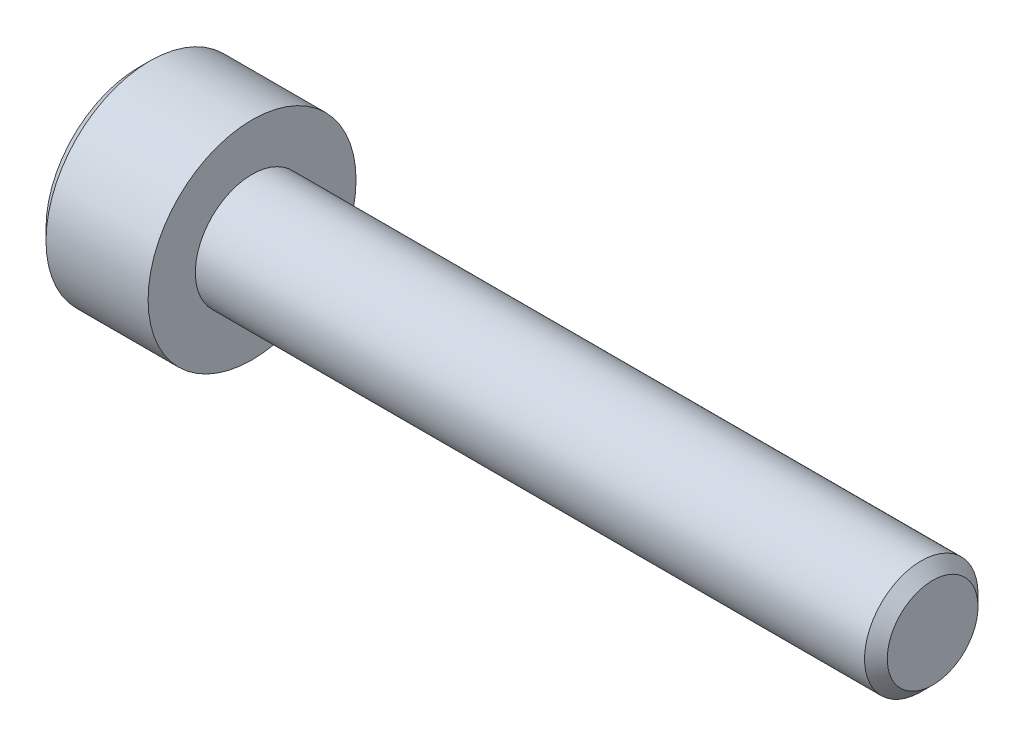
ISO-10303-21;
HEADER;
FILE_DESCRIPTION(('STEP AP214'),'2;1');
FILE_NAME('part.step','',(''),(''),'','','');
FILE_SCHEMA(('AUTOMOTIVE_DESIGN { 1 0 10303 214 1 1 1 1 }'));
ENDSEC;
DATA;
#1=APPLICATION_CONTEXT('core data for automotive mechanical design processes');
#2=APPLICATION_PROTOCOL_DEFINITION('international standard','automotive_design',2000,#1);
#3=PRODUCT_CONTEXT('',#1,'mechanical');
#4=PRODUCT('Part','Part','',(#3));
#5=PRODUCT_RELATED_PRODUCT_CATEGORY('part','',(#4));
#6=PRODUCT_DEFINITION_FORMATION('','',#4);
#7=PRODUCT_DEFINITION_CONTEXT('part definition',#1,'design');
#8=PRODUCT_DEFINITION('design','',#6,#7);
#9=PRODUCT_DEFINITION_SHAPE('','',#8);
#10=(LENGTH_UNIT() NAMED_UNIT(*) SI_UNIT(.MILLI.,.METRE.));
#11=(NAMED_UNIT(*) PLANE_ANGLE_UNIT() SI_UNIT($,.RADIAN.));
#12=(NAMED_UNIT(*) SI_UNIT($,.STERADIAN.) SOLID_ANGLE_UNIT());
#13=UNCERTAINTY_MEASURE_WITH_UNIT(LENGTH_MEASURE(1.E-05),#10,'distance_accuracy_value','');
#14=(GEOMETRIC_REPRESENTATION_CONTEXT(3) GLOBAL_UNCERTAINTY_ASSIGNED_CONTEXT((#13)) GLOBAL_UNIT_ASSIGNED_CONTEXT((#10,
#11,#12)) REPRESENTATION_CONTEXT('',''));
#15=CARTESIAN_POINT('',(0.,0.,0.));
#16=DIRECTION('',(0.,0.,1.));
#17=DIRECTION('',(1.,0.,0.));
#18=AXIS2_PLACEMENT_3D('',#15,#16,#17);
#19=CARTESIAN_POINT('',(-1.5,0.,0.));
#20=DIRECTION('',(-1.,0.,0.));
#21=DIRECTION('',(0.,0.,1.));
#22=AXIS2_PLACEMENT_3D('',#19,#20,#21);
#23=PLANE('',#22);
#24=DIRECTION('',(0.,-1.,0.));
#25=VECTOR('',#24,1.);
#26=CARTESIAN_POINT('',(-1.5,0.721687836487031,-1.25));
#27=LINE('',#26,#25);
#28=CARTESIAN_POINT('',(-1.5,0.721687836487031,-1.25));
#29=VERTEX_POINT('',#28);
#30=CARTESIAN_POINT('',(-1.50000000002341,0.,-1.25));
#31=VERTEX_POINT('',#30);
#32=EDGE_CURVE('E160',#29,#31,#27,.T.);
#33=ORIENTED_EDGE('',*,*,#32,.T.);
#34=CARTESIAN_POINT('',(-1.50000000002341,0.,0.));
#35=DIRECTION('',(1.,0.,0.));
#36=DIRECTION('',(0.,0.,-1.));
#37=AXIS2_PLACEMENT_3D('',#34,#35,#36);
#38=CIRCLE('',#37,1.24999999997044);
#39=CARTESIAN_POINT('',(-1.50000000002341,1.08253175470495,-0.624999999985219));
#40=VERTEX_POINT('',#39);
#41=EDGE_CURVE('E50',#31,#40,#38,.T.);
#42=ORIENTED_EDGE('',*,*,#41,.T.);
#43=DIRECTION('',(0.,-0.499999999999998,-0.86602540378444));
#44=VECTOR('',#43,1.);
#45=CARTESIAN_POINT('',(-1.5,1.44337567297406,0.));
#46=LINE('',#45,#44);
#47=EDGE_CURVE('E247',#40,#29,#46,.T.);
#48=ORIENTED_EDGE('',*,*,#47,.T.);
#49=EDGE_LOOP('',(#33,#42,#48));
#50=FACE_BOUND('',#49,.T.);
#51=ADVANCED_FACE('F35',(#50),#23,.T.);
#52=CARTESIAN_POINT('',(-1.5,1.44337567297406,0.));
#53=VERTEX_POINT('',#52);
#54=EDGE_CURVE('E248',#53,#40,#46,.T.);
#55=ORIENTED_EDGE('',*,*,#54,.T.);
#56=CARTESIAN_POINT('',(-1.50000000002341,1.08253175470495,0.624999999985218));
#57=VERTEX_POINT('',#56);
#58=EDGE_CURVE('E200',#40,#57,#38,.T.);
#59=ORIENTED_EDGE('',*,*,#58,.T.);
#60=DIRECTION('',(0.,0.499999999999998,-0.86602540378444));
#61=VECTOR('',#60,1.);
#62=CARTESIAN_POINT('',(-1.5,0.721687836487032,1.25));
#63=LINE('',#62,#61);
#64=EDGE_CURVE('E244',#57,#53,#63,.T.);
#65=ORIENTED_EDGE('',*,*,#64,.T.);
#66=EDGE_LOOP('',(#55,#59,#65));
#67=FACE_BOUND('',#66,.T.);
#68=ADVANCED_FACE('F123',(#67),#23,.T.);
#69=CARTESIAN_POINT('',(-1.5,0.721687836487032,1.25));
#70=VERTEX_POINT('',#69);
#71=EDGE_CURVE('E245',#70,#57,#63,.T.);
#72=ORIENTED_EDGE('',*,*,#71,.T.);
#73=CARTESIAN_POINT('',(-1.50000000002341,0.,1.24999999997044));
#74=VERTEX_POINT('',#73);
#75=EDGE_CURVE('E384',#57,#74,#38,.T.);
#76=ORIENTED_EDGE('',*,*,#75,.T.);
#77=DIRECTION('',(0.,1.,0.));
#78=VECTOR('',#77,1.);
#79=CARTESIAN_POINT('',(-1.5,-0.721687836487031,1.25));
#80=LINE('',#79,#78);
#81=EDGE_CURVE('E240',#74,#70,#80,.T.);
#82=ORIENTED_EDGE('',*,*,#81,.T.);
#83=EDGE_LOOP('',(#72,#76,#82));
#84=FACE_BOUND('',#83,.T.);
#85=ADVANCED_FACE('F129',(#84),#23,.T.);
#86=CARTESIAN_POINT('',(-1.5,-0.721687836487031,1.25));
#87=VERTEX_POINT('',#86);
#88=EDGE_CURVE('E228',#87,#74,#80,.T.);
#89=ORIENTED_EDGE('',*,*,#88,.T.);
#90=CARTESIAN_POINT('',(-1.50000000002341,-1.08253175470495,0.624999999985219));
#91=VERTEX_POINT('',#90);
#92=EDGE_CURVE('E382',#74,#91,#38,.T.);
#93=ORIENTED_EDGE('',*,*,#92,.T.);
#94=DIRECTION('',(0.,0.499999999999999,0.866025403784439));
#95=VECTOR('',#94,1.);
#96=CARTESIAN_POINT('',(-1.5,-1.44337567297406,0.));
#97=LINE('',#96,#95);
#98=EDGE_CURVE('E180',#91,#87,#97,.T.);
#99=ORIENTED_EDGE('',*,*,#98,.T.);
#100=EDGE_LOOP('',(#89,#93,#99));
#101=FACE_BOUND('',#100,.T.);
#102=ADVANCED_FACE('F144',(#101),#23,.T.);
#103=CARTESIAN_POINT('',(-1.5,-1.44337567297406,0.));
#104=VERTEX_POINT('',#103);
#105=EDGE_CURVE('E233',#104,#91,#97,.T.);
#106=ORIENTED_EDGE('',*,*,#105,.T.);
#107=CARTESIAN_POINT('',(-1.50000000002341,-1.08253175470495,-0.624999999985218));
#108=VERTEX_POINT('',#107);
#109=EDGE_CURVE('E238',#91,#108,#38,.T.);
#110=ORIENTED_EDGE('',*,*,#109,.T.);
#111=DIRECTION('',(0.,-0.499999999999998,0.86602540378444));
#112=VECTOR('',#111,1.);
#113=CARTESIAN_POINT('',(-1.5,-0.721687836487032,-1.25));
#114=LINE('',#113,#112);
#115=EDGE_CURVE('E156',#108,#104,#114,.T.);
#116=ORIENTED_EDGE('',*,*,#115,.T.);
#117=EDGE_LOOP('',(#106,#110,#116));
#118=FACE_BOUND('',#117,.T.);
#119=ADVANCED_FACE('F135',(#118),#23,.T.);
#120=CARTESIAN_POINT('',(-1.5,-0.721687836487032,-1.25));
#121=VERTEX_POINT('',#120);
#122=EDGE_CURVE('E148',#121,#108,#114,.T.);
#123=ORIENTED_EDGE('',*,*,#122,.T.);
#124=EDGE_CURVE('E149',#108,#31,#38,.T.);
#125=ORIENTED_EDGE('',*,*,#124,.T.);
#126=EDGE_CURVE('E151',#31,#121,#27,.T.);
#127=ORIENTED_EDGE('',*,*,#126,.T.);
#128=EDGE_LOOP('',(#123,#125,#127));
#129=FACE_BOUND('',#128,.T.);
#130=ADVANCED_FACE('F125',(#129),#23,.T.);
#131=CARTESIAN_POINT('',(0.,0.,0.));
#132=DIRECTION('',(1.,0.,0.));
#133=DIRECTION('',(0.,0.,-1.));
#134=AXIS2_PLACEMENT_3D('',#131,#132,#133);
#135=PLANE('',#134);
#136=CARTESIAN_POINT('',(0.,0.,0.));
#137=DIRECTION('',(1.,0.,0.));
#138=DIRECTION('',(0.,0.,-1.));
#139=AXIS2_PLACEMENT_3D('',#136,#137,#138);
#140=CIRCLE('',#139,2.75);
#141=CARTESIAN_POINT('',(0.,0.,-2.75));
#142=VERTEX_POINT('',#141);
#143=EDGE_CURVE('E193',#142,#142,#140,.T.);
#144=ORIENTED_EDGE('',*,*,#143,.T.);
#145=EDGE_LOOP('',(#144));
#146=FACE_BOUND('',#145,.T.);
#147=CARTESIAN_POINT('',(0.,0.,0.));
#148=DIRECTION('',(1.,0.,0.));
#149=DIRECTION('',(0.,0.,-1.));
#150=AXIS2_PLACEMENT_3D('',#147,#148,#149);
#151=CIRCLE('',#150,1.5);
#152=CARTESIAN_POINT('',(0.,0.,-1.5));
#153=VERTEX_POINT('',#152);
#154=EDGE_CURVE('E183',#153,#153,#151,.T.);
#155=ORIENTED_EDGE('',*,*,#154,.F.);
#156=EDGE_LOOP('',(#155));
#157=FACE_BOUND('',#156,.T.);
#158=ADVANCED_FACE('F134',(#146,#157),#135,.T.);
#159=CARTESIAN_POINT('',(-3.,0.,0.));
#160=DIRECTION('',(1.,0.,0.));
#161=DIRECTION('',(0.,0.,-1.));
#162=AXIS2_PLACEMENT_3D('',#159,#160,#161);
#163=CYLINDRICAL_SURFACE('',#162,2.75);
#164=CARTESIAN_POINT('',(-2.70000000001219,0.,0.));
#165=DIRECTION('',(-1.,0.,0.));
#166=DIRECTION('',(0.,0.,1.));
#167=AXIS2_PLACEMENT_3D('',#164,#165,#166);
#168=CIRCLE('',#167,2.75);
#169=CARTESIAN_POINT('',(-2.70000000001219,0.,2.75));
#170=VERTEX_POINT('',#169);
#171=EDGE_CURVE('E43',#170,#170,#168,.F.);
#172=ORIENTED_EDGE('',*,*,#171,.T.);
#173=EDGE_LOOP('',(#172));
#174=FACE_BOUND('',#173,.T.);
#175=ORIENTED_EDGE('',*,*,#143,.F.);
#176=EDGE_LOOP('',(#175));
#177=FACE_BOUND('',#176,.T.);
#178=ADVANCED_FACE('F141',(#174,#177),#163,.T.);
#179=CARTESIAN_POINT('',(-3.,2.75,0.));
#180=DIRECTION('',(-1.,0.,0.));
#181=DIRECTION('',(0.,0.,1.));
#182=AXIS2_PLACEMENT_3D('',#179,#180,#181);
#183=PLANE('',#182);
#184=CARTESIAN_POINT('',(-3.,0.,0.));
#185=DIRECTION('',(-1.,0.,0.));
#186=DIRECTION('',(0.,0.,1.));
#187=AXIS2_PLACEMENT_3D('',#184,#185,#186);
#188=CIRCLE('',#187,2.45000000001219);
#189=CARTESIAN_POINT('',(-3.,0.,2.45000000001219));
#190=VERTEX_POINT('',#189);
#191=EDGE_CURVE('E11',#190,#190,#188,.T.);
#192=ORIENTED_EDGE('',*,*,#191,.T.);
#193=EDGE_LOOP('',(#192));
#194=FACE_BOUND('',#193,.T.);
#195=DIRECTION('',(0.,0.499999999999999,0.866025403784439));
#196=VECTOR('',#195,1.);
#197=CARTESIAN_POINT('',(-3.,-1.44337567297406,0.));
#198=LINE('',#197,#196);
#199=CARTESIAN_POINT('',(-3.,-1.44337567297406,0.));
#200=VERTEX_POINT('',#199);
#201=CARTESIAN_POINT('',(-3.,-0.721687836487031,1.25));
#202=VERTEX_POINT('',#201);
#203=EDGE_CURVE('E58',#200,#202,#198,.T.);
#204=ORIENTED_EDGE('',*,*,#203,.F.);
#205=DIRECTION('',(0.,-0.499999999999998,0.86602540378444));
#206=VECTOR('',#205,1.);
#207=CARTESIAN_POINT('',(-3.,-0.721687836487032,-1.25));
#208=LINE('',#207,#206);
#209=CARTESIAN_POINT('',(-3.,-0.721687836487032,-1.25));
#210=VERTEX_POINT('',#209);
#211=EDGE_CURVE('E177',#210,#200,#208,.T.);
#212=ORIENTED_EDGE('',*,*,#211,.F.);
#213=DIRECTION('',(0.,-1.,0.));
#214=VECTOR('',#213,1.);
#215=CARTESIAN_POINT('',(-3.,0.721687836487031,-1.25));
#216=LINE('',#215,#214);
#217=CARTESIAN_POINT('',(-3.,0.721687836487031,-1.25));
#218=VERTEX_POINT('',#217);
#219=EDGE_CURVE('E174',#218,#210,#216,.T.);
#220=ORIENTED_EDGE('',*,*,#219,.F.);
#221=DIRECTION('',(0.,-0.499999999999998,-0.86602540378444));
#222=VECTOR('',#221,1.);
#223=CARTESIAN_POINT('',(-3.,1.44337567297406,0.));
#224=LINE('',#223,#222);
#225=CARTESIAN_POINT('',(-3.,1.44337567297406,0.));
#226=VERTEX_POINT('',#225);
#227=EDGE_CURVE('E171',#226,#218,#224,.T.);
#228=ORIENTED_EDGE('',*,*,#227,.F.);
#229=DIRECTION('',(0.,0.499999999999998,-0.86602540378444));
#230=VECTOR('',#229,1.);
#231=CARTESIAN_POINT('',(-3.,0.721687836487032,1.25));
#232=LINE('',#231,#230);
#233=CARTESIAN_POINT('',(-3.,0.721687836487032,1.25));
#234=VERTEX_POINT('',#233);
#235=EDGE_CURVE('E168',#234,#226,#232,.T.);
#236=ORIENTED_EDGE('',*,*,#235,.F.);
#237=DIRECTION('',(0.,1.,0.));
#238=VECTOR('',#237,1.);
#239=CARTESIAN_POINT('',(-3.,-0.721687836487031,1.25));
#240=LINE('',#239,#238);
#241=EDGE_CURVE('E165',#202,#234,#240,.T.);
#242=ORIENTED_EDGE('',*,*,#241,.F.);
#243=EDGE_LOOP('',(#204,#212,#220,#228,#236,#242));
#244=FACE_BOUND('',#243,.T.);
#245=ADVANCED_FACE('F213',(#194,#244),#183,.T.);
#246=CARTESIAN_POINT('',(18.,0.,0.));
#247=DIRECTION('',(-1.,0.,0.));
#248=DIRECTION('',(0.,0.,1.));
#249=AXIS2_PLACEMENT_3D('',#246,#247,#248);
#250=CYLINDRICAL_SURFACE('',#249,1.5);
#251=CARTESIAN_POINT('',(17.7000000000122,0.,0.));
#252=DIRECTION('',(1.,0.,0.));
#253=DIRECTION('',(0.,0.,-1.));
#254=AXIS2_PLACEMENT_3D('',#251,#252,#253);
#255=CIRCLE('',#254,1.5);
#256=CARTESIAN_POINT('',(17.7000000000122,0.,-1.5));
#257=VERTEX_POINT('',#256);
#258=EDGE_CURVE('E199',#257,#257,#255,.F.);
#259=ORIENTED_EDGE('',*,*,#258,.T.);
#260=EDGE_LOOP('',(#259));
#261=FACE_BOUND('',#260,.T.);
#262=ORIENTED_EDGE('',*,*,#154,.T.);
#263=EDGE_LOOP('',(#262));
#264=FACE_BOUND('',#263,.T.);
#265=ADVANCED_FACE('F216',(#261,#264),#250,.T.);
#266=CARTESIAN_POINT('',(18.,0.,0.));
#267=DIRECTION('',(1.,0.,0.));
#268=DIRECTION('',(0.,0.,-1.));
#269=AXIS2_PLACEMENT_3D('',#266,#267,#268);
#270=PLANE('',#269);
#271=CARTESIAN_POINT('',(18.,0.,0.));
#272=DIRECTION('',(1.,0.,0.));
#273=DIRECTION('',(0.,0.,-1.));
#274=AXIS2_PLACEMENT_3D('',#271,#272,#273);
#275=CIRCLE('',#274,1.20000000001219);
#276=CARTESIAN_POINT('',(18.,0.,-1.20000000001219));
#277=VERTEX_POINT('',#276);
#278=EDGE_CURVE('E196',#277,#277,#275,.T.);
#279=ORIENTED_EDGE('',*,*,#278,.T.);
#280=EDGE_LOOP('',(#279));
#281=FACE_BOUND('',#280,.T.);
#282=ADVANCED_FACE('F266',(#281),#270,.T.);
#283=CARTESIAN_POINT('',(-1.5,-1.44337567297406,0.));
#284=DIRECTION('',(0.,-0.866025403784439,0.499999999999999));
#285=DIRECTION('',(0.,-0.499999999999999,-0.866025403784439));
#286=AXIS2_PLACEMENT_3D('',#283,#284,#285);
#287=PLANE('',#286);
#288=ORIENTED_EDGE('',*,*,#203,.T.);
#289=DIRECTION('',(-1.,0.,0.));
#290=VECTOR('',#289,1.);
#291=CARTESIAN_POINT('',(-1.5,-0.721687836487031,1.25));
#292=LINE('',#291,#290);
#293=EDGE_CURVE('E155',#87,#202,#292,.T.);
#294=ORIENTED_EDGE('',*,*,#293,.F.);
#295=ORIENTED_EDGE('',*,*,#98,.F.);
#296=ORIENTED_EDGE('',*,*,#105,.F.);
#297=DIRECTION('',(-1.,0.,0.));
#298=VECTOR('',#297,1.);
#299=CARTESIAN_POINT('',(-1.5,-1.44337567297406,0.));
#300=LINE('',#299,#298);
#301=EDGE_CURVE('E181',#104,#200,#300,.T.);
#302=ORIENTED_EDGE('',*,*,#301,.T.);
#303=EDGE_LOOP('',(#288,#294,#295,#296,#302));
#304=FACE_BOUND('',#303,.T.);
#305=ADVANCED_FACE('F230',(#304),#287,.F.);
#306=CARTESIAN_POINT('',(-1.5,-0.721687836487032,-1.25));
#307=DIRECTION('',(0.,-0.86602540378444,-0.499999999999998));
#308=DIRECTION('',(0.,0.499999999999998,-0.86602540378444));
#309=AXIS2_PLACEMENT_3D('',#306,#307,#308);
#310=PLANE('',#309);
#311=ORIENTED_EDGE('',*,*,#211,.T.);
#312=ORIENTED_EDGE('',*,*,#301,.F.);
#313=ORIENTED_EDGE('',*,*,#115,.F.);
#314=ORIENTED_EDGE('',*,*,#122,.F.);
#315=DIRECTION('',(-1.,0.,0.));
#316=VECTOR('',#315,1.);
#317=CARTESIAN_POINT('',(-1.5,-0.721687836487032,-1.25));
#318=LINE('',#317,#316);
#319=EDGE_CURVE('E184',#121,#210,#318,.T.);
#320=ORIENTED_EDGE('',*,*,#319,.T.);
#321=EDGE_LOOP('',(#311,#312,#313,#314,#320));
#322=FACE_BOUND('',#321,.T.);
#323=ADVANCED_FACE('F259',(#322),#310,.F.);
#324=CARTESIAN_POINT('',(-1.5,0.721687836487031,-1.25));
#325=DIRECTION('',(0.,0.,-1.));
#326=DIRECTION('',(0.,1.,0.));
#327=AXIS2_PLACEMENT_3D('',#324,#325,#326);
#328=PLANE('',#327);
#329=ORIENTED_EDGE('',*,*,#219,.T.);
#330=ORIENTED_EDGE('',*,*,#319,.F.);
#331=ORIENTED_EDGE('',*,*,#126,.F.);
#332=ORIENTED_EDGE('',*,*,#32,.F.);
#333=DIRECTION('',(-1.,0.,0.));
#334=VECTOR('',#333,1.);
#335=CARTESIAN_POINT('',(-1.5,0.721687836487031,-1.25));
#336=LINE('',#335,#334);
#337=EDGE_CURVE('E186',#29,#218,#336,.T.);
#338=ORIENTED_EDGE('',*,*,#337,.T.);
#339=EDGE_LOOP('',(#329,#330,#331,#332,#338));
#340=FACE_BOUND('',#339,.T.);
#341=ADVANCED_FACE('F258',(#340),#328,.F.);
#342=CARTESIAN_POINT('',(-1.5,1.44337567297406,0.));
#343=DIRECTION('',(0.,0.86602540378444,-0.499999999999998));
#344=DIRECTION('',(0.,0.499999999999998,0.86602540378444));
#345=AXIS2_PLACEMENT_3D('',#342,#343,#344);
#346=PLANE('',#345);
#347=ORIENTED_EDGE('',*,*,#227,.T.);
#348=ORIENTED_EDGE('',*,*,#337,.F.);
#349=ORIENTED_EDGE('',*,*,#47,.F.);
#350=ORIENTED_EDGE('',*,*,#54,.F.);
#351=DIRECTION('',(-1.,0.,0.));
#352=VECTOR('',#351,1.);
#353=CARTESIAN_POINT('',(-1.5,1.44337567297406,0.));
#354=LINE('',#353,#352);
#355=EDGE_CURVE('E188',#53,#226,#354,.T.);
#356=ORIENTED_EDGE('',*,*,#355,.T.);
#357=EDGE_LOOP('',(#347,#348,#349,#350,#356));
#358=FACE_BOUND('',#357,.T.);
#359=ADVANCED_FACE('F256',(#358),#346,.F.);
#360=CARTESIAN_POINT('',(-1.5,0.721687836487032,1.25));
#361=DIRECTION('',(0.,0.86602540378444,0.499999999999998));
#362=DIRECTION('',(0.,-0.499999999999998,0.86602540378444));
#363=AXIS2_PLACEMENT_3D('',#360,#361,#362);
#364=PLANE('',#363);
#365=ORIENTED_EDGE('',*,*,#235,.T.);
#366=ORIENTED_EDGE('',*,*,#355,.F.);
#367=ORIENTED_EDGE('',*,*,#64,.F.);
#368=ORIENTED_EDGE('',*,*,#71,.F.);
#369=DIRECTION('',(-1.,0.,0.));
#370=VECTOR('',#369,1.);
#371=CARTESIAN_POINT('',(-1.5,0.721687836487032,1.25));
#372=LINE('',#371,#370);
#373=EDGE_CURVE('E158',#70,#234,#372,.T.);
#374=ORIENTED_EDGE('',*,*,#373,.T.);
#375=EDGE_LOOP('',(#365,#366,#367,#368,#374));
#376=FACE_BOUND('',#375,.T.);
#377=ADVANCED_FACE('F118',(#376),#364,.F.);
#378=CARTESIAN_POINT('',(-1.5,-0.721687836487031,1.25));
#379=DIRECTION('',(0.,0.,1.));
#380=DIRECTION('',(1.,0.,0.));
#381=AXIS2_PLACEMENT_3D('',#378,#379,#380);
#382=PLANE('',#381);
#383=ORIENTED_EDGE('',*,*,#241,.T.);
#384=ORIENTED_EDGE('',*,*,#373,.F.);
#385=ORIENTED_EDGE('',*,*,#81,.F.);
#386=ORIENTED_EDGE('',*,*,#88,.F.);
#387=ORIENTED_EDGE('',*,*,#293,.T.);
#388=EDGE_LOOP('',(#383,#384,#385,#386,#387));
#389=FACE_BOUND('',#388,.T.);
#390=ADVANCED_FACE('F111',(#389),#382,.F.);
#391=CARTESIAN_POINT('',(-1.16506350937176,0.,0.));
#392=DIRECTION('',(-1.,0.,0.));
#393=DIRECTION('',(0.,0.,1.));
#394=AXIS2_PLACEMENT_3D('',#391,#392,#393);
#395=CONICAL_SURFACE('',#394,0.,1.30899693890568);
#396=ORIENTED_EDGE('',*,*,#41,.F.);
#397=ORIENTED_EDGE('',*,*,#124,.F.);
#398=ORIENTED_EDGE('',*,*,#109,.F.);
#399=ORIENTED_EDGE('',*,*,#92,.F.);
#400=ORIENTED_EDGE('',*,*,#75,.F.);
#401=ORIENTED_EDGE('',*,*,#58,.F.);
#402=EDGE_LOOP('',(#396,#397,#398,#399,#400,#401));
#403=FACE_BOUND('',#402,.T.);
#404=CARTESIAN_POINT('',(-1.16506350937176,0.,0.));
#405=VERTEX_POINT('',#404);
#406=VERTEX_LOOP('',#405);
#407=FACE_BOUND('',#406,.T.);
#408=ADVANCED_FACE('F108',(#403,#407),#395,.F.);
#409=CARTESIAN_POINT('',(18.,0.,0.));
#410=DIRECTION('',(-1.,0.,0.));
#411=DIRECTION('',(0.,0.,1.));
#412=AXIS2_PLACEMENT_3D('',#409,#410,#411);
#413=CONICAL_SURFACE('',#412,1.20000000001219,0.78539816339744);
#414=ORIENTED_EDGE('',*,*,#258,.F.);
#415=EDGE_LOOP('',(#414));
#416=FACE_BOUND('',#415,.T.);
#417=ORIENTED_EDGE('',*,*,#278,.F.);
#418=EDGE_LOOP('',(#417));
#419=FACE_BOUND('',#418,.T.);
#420=ADVANCED_FACE('F110',(#416,#419),#413,.T.);
#421=CARTESIAN_POINT('',(-2.70000000001219,0.,0.));
#422=DIRECTION('',(1.,0.,0.));
#423=DIRECTION('',(0.,0.,-1.));
#424=AXIS2_PLACEMENT_3D('',#421,#422,#423);
#425=CONICAL_SURFACE('',#424,2.75,0.78539816339745);
#426=ORIENTED_EDGE('',*,*,#191,.F.);
#427=EDGE_LOOP('',(#426));
#428=FACE_BOUND('',#427,.T.);
#429=ORIENTED_EDGE('',*,*,#171,.F.);
#430=EDGE_LOOP('',(#429));
#431=FACE_BOUND('',#430,.T.);
#432=ADVANCED_FACE('F37',(#428,#431),#425,.T.);
#433=CLOSED_SHELL('',(#51,#68,#85,#102,#119,#130,#158,#178,#245,#265,#282,#305,#323,#341,#359,
#377,#390,#408,#420,#432));
#434=MANIFOLD_SOLID_BREP('B2',#433);
#435=ADVANCED_BREP_SHAPE_REPRESENTATION('',(#18,#434),#14);
#436=SHAPE_DEFINITION_REPRESENTATION(#9,#435);
ENDSEC;
END-ISO-10303-21;
